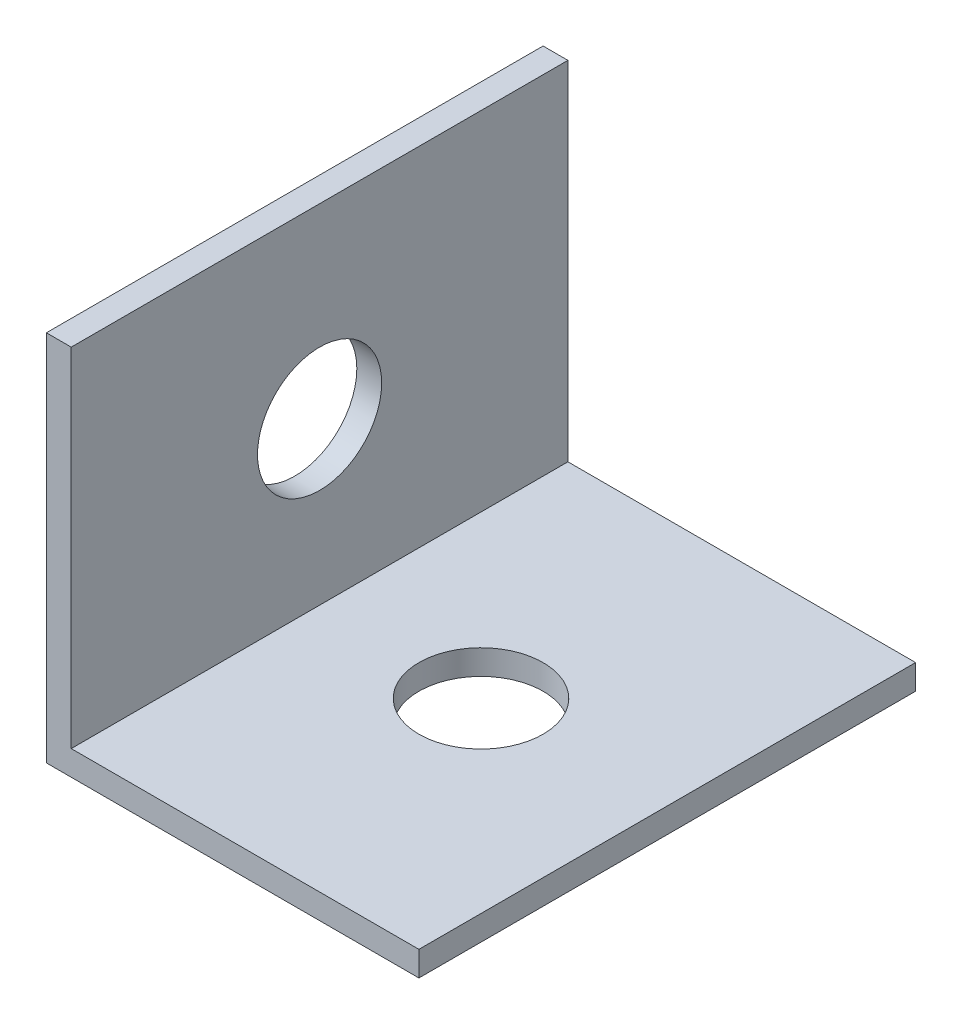
ISO-10303-21;
HEADER;
FILE_DESCRIPTION(('STEP AP214'),'2;1');
FILE_NAME('part.step','',(''),(''),'','','');
FILE_SCHEMA(('AUTOMOTIVE_DESIGN { 1 0 10303 214 1 1 1 1 }'));
ENDSEC;
DATA;
#1=APPLICATION_CONTEXT('core data for automotive mechanical design processes');
#2=APPLICATION_PROTOCOL_DEFINITION('international standard','automotive_design',2000,#1);
#3=PRODUCT_CONTEXT('',#1,'mechanical');
#4=PRODUCT('Part','Part','',(#3));
#5=PRODUCT_RELATED_PRODUCT_CATEGORY('part','',(#4));
#6=PRODUCT_DEFINITION_FORMATION('','',#4);
#7=PRODUCT_DEFINITION_CONTEXT('part definition',#1,'design');
#8=PRODUCT_DEFINITION('design','',#6,#7);
#9=PRODUCT_DEFINITION_SHAPE('','',#8);
#10=(LENGTH_UNIT() NAMED_UNIT(*) SI_UNIT(.MILLI.,.METRE.));
#11=(NAMED_UNIT(*) PLANE_ANGLE_UNIT() SI_UNIT($,.RADIAN.));
#12=(NAMED_UNIT(*) SI_UNIT($,.STERADIAN.) SOLID_ANGLE_UNIT());
#13=UNCERTAINTY_MEASURE_WITH_UNIT(LENGTH_MEASURE(1.E-05),#10,'distance_accuracy_value','');
#14=(GEOMETRIC_REPRESENTATION_CONTEXT(3) GLOBAL_UNCERTAINTY_ASSIGNED_CONTEXT((#13)) GLOBAL_UNIT_ASSIGNED_CONTEXT((#10,
#11,#12)) REPRESENTATION_CONTEXT('',''));
#15=CARTESIAN_POINT('',(0.,0.,0.));
#16=DIRECTION('',(0.,0.,1.));
#17=DIRECTION('',(1.,0.,0.));
#18=AXIS2_PLACEMENT_3D('',#15,#16,#17);
#19=CARTESIAN_POINT('',(38.1,0.,50.8));
#20=DIRECTION('',(0.,1.,0.));
#21=DIRECTION('',(-1.,0.,0.));
#22=AXIS2_PLACEMENT_3D('',#19,#20,#21);
#23=PLANE('',#22);
#24=CARTESIAN_POINT('',(19.05,0.,25.4));
#25=DIRECTION('',(0.,1.,0.));
#26=DIRECTION('',(0.,0.,1.));
#27=AXIS2_PLACEMENT_3D('',#24,#25,#26);
#28=CIRCLE('',#27,6.34999999999999);
#29=CARTESIAN_POINT('',(19.05,0.,31.75));
#30=VERTEX_POINT('',#29);
#31=EDGE_CURVE('E183',#30,#30,#28,.T.);
#32=ORIENTED_EDGE('',*,*,#31,.T.);
#33=EDGE_LOOP('',(#32));
#34=FACE_BOUND('',#33,.T.);
#35=DIRECTION('',(1.,0.,0.));
#36=VECTOR('',#35,1.);
#37=CARTESIAN_POINT('',(38.1,0.,0.));
#38=LINE('',#37,#36);
#39=CARTESIAN_POINT('',(0.,0.,0.));
#40=VERTEX_POINT('',#39);
#41=CARTESIAN_POINT('',(38.1,0.,0.));
#42=VERTEX_POINT('',#41);
#43=EDGE_CURVE('E128',#40,#42,#38,.T.);
#44=ORIENTED_EDGE('',*,*,#43,.T.);
#45=DIRECTION('',(0.,0.,-1.));
#46=VECTOR('',#45,1.);
#47=CARTESIAN_POINT('',(38.1,0.,50.8));
#48=LINE('',#47,#46);
#49=CARTESIAN_POINT('',(38.1,0.,50.8));
#50=VERTEX_POINT('',#49);
#51=EDGE_CURVE('E11',#50,#42,#48,.T.);
#52=ORIENTED_EDGE('',*,*,#51,.F.);
#53=DIRECTION('',(1.,0.,0.));
#54=VECTOR('',#53,1.);
#55=CARTESIAN_POINT('',(38.1,0.,50.8));
#56=LINE('',#55,#54);
#57=CARTESIAN_POINT('',(0.,0.,50.8));
#58=VERTEX_POINT('',#57);
#59=EDGE_CURVE('E145',#58,#50,#56,.T.);
#60=ORIENTED_EDGE('',*,*,#59,.F.);
#61=DIRECTION('',(0.,0.,-1.));
#62=VECTOR('',#61,1.);
#63=CARTESIAN_POINT('',(0.,0.,50.8));
#64=LINE('',#63,#62);
#65=EDGE_CURVE('E124',#58,#40,#64,.T.);
#66=ORIENTED_EDGE('',*,*,#65,.T.);
#67=EDGE_LOOP('',(#44,#52,#60,#66));
#68=FACE_BOUND('',#67,.T.);
#69=ADVANCED_FACE('F38',(#34,#68),#23,.F.);
#70=CARTESIAN_POINT('',(38.1,2.54,50.8));
#71=DIRECTION('',(-1.,0.,0.));
#72=DIRECTION('',(0.,0.,1.));
#73=AXIS2_PLACEMENT_3D('',#70,#71,#72);
#74=PLANE('',#73);
#75=DIRECTION('',(0.,1.,0.));
#76=VECTOR('',#75,1.);
#77=CARTESIAN_POINT('',(38.1,2.54,0.));
#78=LINE('',#77,#76);
#79=CARTESIAN_POINT('',(38.1,2.54,0.));
#80=VERTEX_POINT('',#79);
#81=EDGE_CURVE('E132',#42,#80,#78,.T.);
#82=ORIENTED_EDGE('',*,*,#81,.T.);
#83=DIRECTION('',(0.,0.,-1.));
#84=VECTOR('',#83,1.);
#85=CARTESIAN_POINT('',(38.1,2.54,50.8));
#86=LINE('',#85,#84);
#87=CARTESIAN_POINT('',(38.1,2.54,50.8));
#88=VERTEX_POINT('',#87);
#89=EDGE_CURVE('E47',#88,#80,#86,.T.);
#90=ORIENTED_EDGE('',*,*,#89,.F.);
#91=DIRECTION('',(0.,1.,0.));
#92=VECTOR('',#91,1.);
#93=CARTESIAN_POINT('',(38.1,2.54,50.8));
#94=LINE('',#93,#92);
#95=EDGE_CURVE('E92',#50,#88,#94,.T.);
#96=ORIENTED_EDGE('',*,*,#95,.F.);
#97=ORIENTED_EDGE('',*,*,#51,.T.);
#98=EDGE_LOOP('',(#82,#90,#96,#97));
#99=FACE_BOUND('',#98,.T.);
#100=ADVANCED_FACE('F176',(#99),#74,.F.);
#101=CARTESIAN_POINT('',(2.54,2.54,50.8));
#102=DIRECTION('',(0.,-1.,0.));
#103=DIRECTION('',(0.,0.,-1.));
#104=AXIS2_PLACEMENT_3D('',#101,#102,#103);
#105=PLANE('',#104);
#106=CARTESIAN_POINT('',(19.05,2.54,25.4));
#107=DIRECTION('',(0.,1.,0.));
#108=DIRECTION('',(0.,0.,1.));
#109=AXIS2_PLACEMENT_3D('',#106,#107,#108);
#110=CIRCLE('',#109,6.34999999999999);
#111=CARTESIAN_POINT('',(19.05,2.54,31.75));
#112=VERTEX_POINT('',#111);
#113=EDGE_CURVE('E187',#112,#112,#110,.T.);
#114=ORIENTED_EDGE('',*,*,#113,.F.);
#115=EDGE_LOOP('',(#114));
#116=FACE_BOUND('',#115,.T.);
#117=DIRECTION('',(-1.,0.,0.));
#118=VECTOR('',#117,1.);
#119=CARTESIAN_POINT('',(2.54,2.54,0.));
#120=LINE('',#119,#118);
#121=CARTESIAN_POINT('',(2.54,2.54,0.));
#122=VERTEX_POINT('',#121);
#123=EDGE_CURVE('E136',#80,#122,#120,.T.);
#124=ORIENTED_EDGE('',*,*,#123,.T.);
#125=DIRECTION('',(0.,0.,-1.));
#126=VECTOR('',#125,1.);
#127=CARTESIAN_POINT('',(2.54,2.54,50.8));
#128=LINE('',#127,#126);
#129=CARTESIAN_POINT('',(2.54,2.54,50.8));
#130=VERTEX_POINT('',#129);
#131=EDGE_CURVE('E116',#130,#122,#128,.T.);
#132=ORIENTED_EDGE('',*,*,#131,.F.);
#133=DIRECTION('',(-1.,0.,0.));
#134=VECTOR('',#133,1.);
#135=CARTESIAN_POINT('',(2.54,2.54,50.8));
#136=LINE('',#135,#134);
#137=EDGE_CURVE('E105',#88,#130,#136,.T.);
#138=ORIENTED_EDGE('',*,*,#137,.F.);
#139=ORIENTED_EDGE('',*,*,#89,.T.);
#140=EDGE_LOOP('',(#124,#132,#138,#139));
#141=FACE_BOUND('',#140,.T.);
#142=ADVANCED_FACE('F156',(#116,#141),#105,.F.);
#143=CARTESIAN_POINT('',(2.54,38.1,50.8));
#144=DIRECTION('',(-1.,0.,0.));
#145=DIRECTION('',(0.,-1.,0.));
#146=AXIS2_PLACEMENT_3D('',#143,#144,#145);
#147=PLANE('',#146);
#148=CARTESIAN_POINT('',(2.54,19.05,25.4));
#149=DIRECTION('',(1.,0.,0.));
#150=DIRECTION('',(0.,0.,-1.));
#151=AXIS2_PLACEMENT_3D('',#148,#149,#150);
#152=CIRCLE('',#151,6.34999999999999);
#153=CARTESIAN_POINT('',(2.54,19.05,19.05));
#154=VERTEX_POINT('',#153);
#155=EDGE_CURVE('E186',#154,#154,#152,.T.);
#156=ORIENTED_EDGE('',*,*,#155,.F.);
#157=EDGE_LOOP('',(#156));
#158=FACE_BOUND('',#157,.T.);
#159=DIRECTION('',(0.,1.,0.));
#160=VECTOR('',#159,1.);
#161=CARTESIAN_POINT('',(2.54,38.1,0.));
#162=LINE('',#161,#160);
#163=CARTESIAN_POINT('',(2.54,38.1,0.));
#164=VERTEX_POINT('',#163);
#165=EDGE_CURVE('E114',#122,#164,#162,.T.);
#166=ORIENTED_EDGE('',*,*,#165,.T.);
#167=DIRECTION('',(0.,0.,-1.));
#168=VECTOR('',#167,1.);
#169=CARTESIAN_POINT('',(2.54,38.1,50.8));
#170=LINE('',#169,#168);
#171=CARTESIAN_POINT('',(2.54,38.1,50.8));
#172=VERTEX_POINT('',#171);
#173=EDGE_CURVE('E111',#172,#164,#170,.T.);
#174=ORIENTED_EDGE('',*,*,#173,.F.);
#175=DIRECTION('',(0.,1.,0.));
#176=VECTOR('',#175,1.);
#177=CARTESIAN_POINT('',(2.54,38.1,50.8));
#178=LINE('',#177,#176);
#179=EDGE_CURVE('E99',#130,#172,#178,.T.);
#180=ORIENTED_EDGE('',*,*,#179,.F.);
#181=ORIENTED_EDGE('',*,*,#131,.T.);
#182=EDGE_LOOP('',(#166,#174,#180,#181));
#183=FACE_BOUND('',#182,.T.);
#184=ADVANCED_FACE('F112',(#158,#183),#147,.F.);
#185=CARTESIAN_POINT('',(0.,38.1,50.8));
#186=DIRECTION('',(0.,-1.,0.));
#187=DIRECTION('',(0.,0.,-1.));
#188=AXIS2_PLACEMENT_3D('',#185,#186,#187);
#189=PLANE('',#188);
#190=DIRECTION('',(-1.,0.,0.));
#191=VECTOR('',#190,1.);
#192=CARTESIAN_POINT('',(0.,38.1,0.));
#193=LINE('',#192,#191);
#194=CARTESIAN_POINT('',(0.,38.1,0.));
#195=VERTEX_POINT('',#194);
#196=EDGE_CURVE('E78',#164,#195,#193,.T.);
#197=ORIENTED_EDGE('',*,*,#196,.T.);
#198=DIRECTION('',(0.,0.,-1.));
#199=VECTOR('',#198,1.);
#200=CARTESIAN_POINT('',(0.,38.1,50.8));
#201=LINE('',#200,#199);
#202=CARTESIAN_POINT('',(0.,38.1,50.8));
#203=VERTEX_POINT('',#202);
#204=EDGE_CURVE('E117',#203,#195,#201,.T.);
#205=ORIENTED_EDGE('',*,*,#204,.F.);
#206=DIRECTION('',(-1.,0.,0.));
#207=VECTOR('',#206,1.);
#208=CARTESIAN_POINT('',(0.,38.1,50.8));
#209=LINE('',#208,#207);
#210=EDGE_CURVE('E103',#172,#203,#209,.T.);
#211=ORIENTED_EDGE('',*,*,#210,.F.);
#212=ORIENTED_EDGE('',*,*,#173,.T.);
#213=EDGE_LOOP('',(#197,#205,#211,#212));
#214=FACE_BOUND('',#213,.T.);
#215=ADVANCED_FACE('F119',(#214),#189,.F.);
#216=CARTESIAN_POINT('',(0.,0.,50.8));
#217=DIRECTION('',(1.,0.,0.));
#218=DIRECTION('',(0.,0.,-1.));
#219=AXIS2_PLACEMENT_3D('',#216,#217,#218);
#220=PLANE('',#219);
#221=CARTESIAN_POINT('',(0.,19.05,25.4));
#222=DIRECTION('',(1.,0.,0.));
#223=DIRECTION('',(0.,0.,-1.));
#224=AXIS2_PLACEMENT_3D('',#221,#222,#223);
#225=CIRCLE('',#224,6.34999999999999);
#226=CARTESIAN_POINT('',(0.,19.05,19.05));
#227=VERTEX_POINT('',#226);
#228=EDGE_CURVE('E133',#227,#227,#225,.T.);
#229=ORIENTED_EDGE('',*,*,#228,.T.);
#230=EDGE_LOOP('',(#229));
#231=FACE_BOUND('',#230,.T.);
#232=DIRECTION('',(0.,-1.,0.));
#233=VECTOR('',#232,1.);
#234=CARTESIAN_POINT('',(0.,0.,0.));
#235=LINE('',#234,#233);
#236=EDGE_CURVE('E84',#195,#40,#235,.T.);
#237=ORIENTED_EDGE('',*,*,#236,.T.);
#238=ORIENTED_EDGE('',*,*,#65,.F.);
#239=DIRECTION('',(0.,-1.,0.));
#240=VECTOR('',#239,1.);
#241=CARTESIAN_POINT('',(0.,0.,50.8));
#242=LINE('',#241,#240);
#243=EDGE_CURVE('E55',#203,#58,#242,.T.);
#244=ORIENTED_EDGE('',*,*,#243,.F.);
#245=ORIENTED_EDGE('',*,*,#204,.T.);
#246=EDGE_LOOP('',(#237,#238,#244,#245));
#247=FACE_BOUND('',#246,.T.);
#248=ADVANCED_FACE('F163',(#231,#247),#220,.F.);
#249=CARTESIAN_POINT('',(0.,0.,50.8));
#250=DIRECTION('',(0.,0.,-1.));
#251=DIRECTION('',(-1.,0.,0.));
#252=AXIS2_PLACEMENT_3D('',#249,#250,#251);
#253=PLANE('',#252);
#254=ORIENTED_EDGE('',*,*,#59,.T.);
#255=ORIENTED_EDGE('',*,*,#95,.T.);
#256=ORIENTED_EDGE('',*,*,#137,.T.);
#257=ORIENTED_EDGE('',*,*,#179,.T.);
#258=ORIENTED_EDGE('',*,*,#210,.T.);
#259=ORIENTED_EDGE('',*,*,#243,.T.);
#260=EDGE_LOOP('',(#254,#255,#256,#257,#258,#259));
#261=FACE_BOUND('',#260,.T.);
#262=ADVANCED_FACE('F101',(#261),#253,.F.);
#263=CARTESIAN_POINT('',(0.,0.,0.));
#264=DIRECTION('',(0.,0.,-1.));
#265=DIRECTION('',(-1.,0.,0.));
#266=AXIS2_PLACEMENT_3D('',#263,#264,#265);
#267=PLANE('',#266);
#268=ORIENTED_EDGE('',*,*,#43,.F.);
#269=ORIENTED_EDGE('',*,*,#236,.F.);
#270=ORIENTED_EDGE('',*,*,#196,.F.);
#271=ORIENTED_EDGE('',*,*,#165,.F.);
#272=ORIENTED_EDGE('',*,*,#123,.F.);
#273=ORIENTED_EDGE('',*,*,#81,.F.);
#274=EDGE_LOOP('',(#268,#269,#270,#271,#272,#273));
#275=FACE_BOUND('',#274,.T.);
#276=ADVANCED_FACE('F159',(#275),#267,.T.);
#277=CARTESIAN_POINT('',(2.54,19.05,25.4));
#278=DIRECTION('',(1.,0.,0.));
#279=DIRECTION('',(0.,0.,-1.));
#280=AXIS2_PLACEMENT_3D('',#277,#278,#279);
#281=CYLINDRICAL_SURFACE('',#280,6.34999999999999);
#282=ORIENTED_EDGE('',*,*,#228,.F.);
#283=EDGE_LOOP('',(#282));
#284=FACE_BOUND('',#283,.T.);
#285=ORIENTED_EDGE('',*,*,#155,.T.);
#286=EDGE_LOOP('',(#285));
#287=FACE_BOUND('',#286,.T.);
#288=ADVANCED_FACE('F217',(#284,#287),#281,.F.);
#289=CARTESIAN_POINT('',(19.05,2.54,25.4));
#290=DIRECTION('',(0.,1.,0.));
#291=DIRECTION('',(0.,0.,1.));
#292=AXIS2_PLACEMENT_3D('',#289,#290,#291);
#293=CYLINDRICAL_SURFACE('',#292,6.34999999999999);
#294=ORIENTED_EDGE('',*,*,#31,.F.);
#295=EDGE_LOOP('',(#294));
#296=FACE_BOUND('',#295,.T.);
#297=ORIENTED_EDGE('',*,*,#113,.T.);
#298=EDGE_LOOP('',(#297));
#299=FACE_BOUND('',#298,.T.);
#300=ADVANCED_FACE('F220',(#296,#299),#293,.F.);
#301=CLOSED_SHELL('',(#69,#100,#142,#184,#215,#248,#262,#276,#288,#300));
#302=MANIFOLD_SOLID_BREP('B2',#301);
#303=ADVANCED_BREP_SHAPE_REPRESENTATION('',(#18,#302),#14);
#304=SHAPE_DEFINITION_REPRESENTATION(#9,#303);
ENDSEC;
END-ISO-10303-21;
